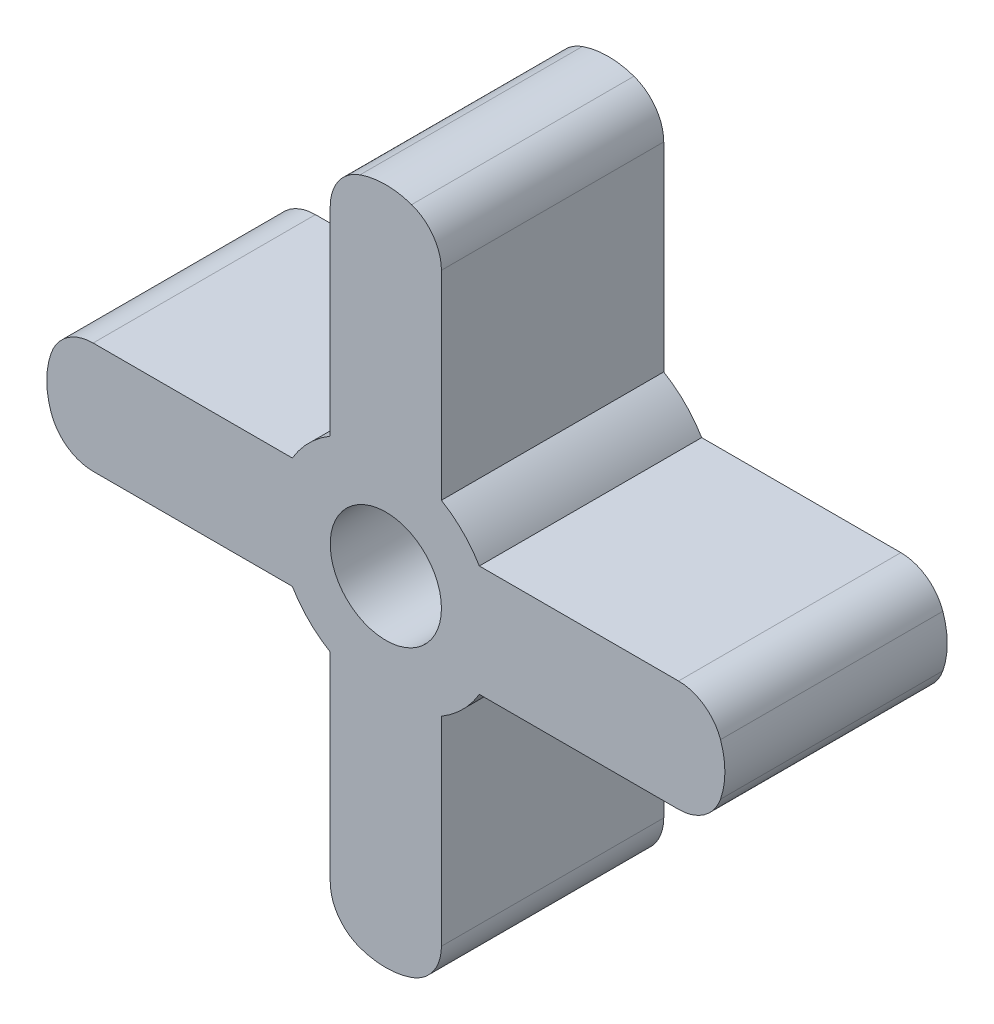
ISO-10303-21;
HEADER;
FILE_DESCRIPTION(('STEP AP214'),'2;1');
FILE_NAME('part.step','',(''),(''),'','','');
FILE_SCHEMA(('AUTOMOTIVE_DESIGN { 1 0 10303 214 1 1 1 1 }'));
ENDSEC;
DATA;
#1=APPLICATION_CONTEXT('core data for automotive mechanical design processes');
#2=APPLICATION_PROTOCOL_DEFINITION('international standard','automotive_design',2000,#1);
#3=PRODUCT_CONTEXT('',#1,'mechanical');
#4=PRODUCT('Part','Part','',(#3));
#5=PRODUCT_RELATED_PRODUCT_CATEGORY('part','',(#4));
#6=PRODUCT_DEFINITION_FORMATION('','',#4);
#7=PRODUCT_DEFINITION_CONTEXT('part definition',#1,'design');
#8=PRODUCT_DEFINITION('design','',#6,#7);
#9=PRODUCT_DEFINITION_SHAPE('','',#8);
#10=(LENGTH_UNIT() NAMED_UNIT(*) SI_UNIT(.MILLI.,.METRE.));
#11=(NAMED_UNIT(*) PLANE_ANGLE_UNIT() SI_UNIT($,.RADIAN.));
#12=(NAMED_UNIT(*) SI_UNIT($,.STERADIAN.) SOLID_ANGLE_UNIT());
#13=UNCERTAINTY_MEASURE_WITH_UNIT(LENGTH_MEASURE(1.E-05),#10,'distance_accuracy_value','');
#14=(GEOMETRIC_REPRESENTATION_CONTEXT(3) GLOBAL_UNCERTAINTY_ASSIGNED_CONTEXT((#13)) GLOBAL_UNIT_ASSIGNED_CONTEXT((#10,
#11,#12)) REPRESENTATION_CONTEXT('',''));
#15=CARTESIAN_POINT('',(0.,0.,0.));
#16=DIRECTION('',(0.,0.,1.));
#17=DIRECTION('',(1.,0.,0.));
#18=AXIS2_PLACEMENT_3D('',#15,#16,#17);
#19=CARTESIAN_POINT('',(0.,0.,10.));
#20=DIRECTION('',(0.,0.,-1.));
#21=DIRECTION('',(-1.,0.,0.));
#22=AXIS2_PLACEMENT_3D('',#19,#20,#21);
#23=CYLINDRICAL_SURFACE('',#22,4.89273251846333);
#24=CARTESIAN_POINT('',(0.,0.,0.));
#25=DIRECTION('',(0.,0.,1.));
#26=DIRECTION('',(1.,0.,0.));
#27=AXIS2_PLACEMENT_3D('',#24,#25,#26);
#28=CIRCLE('',#27,4.89273251846333);
#29=CARTESIAN_POINT('',(-2.5,4.20580925592549,0.));
#30=VERTEX_POINT('',#29);
#31=CARTESIAN_POINT('',(-4.20580925592549,2.5,0.));
#32=VERTEX_POINT('',#31);
#33=EDGE_CURVE('E227',#30,#32,#28,.T.);
#34=ORIENTED_EDGE('',*,*,#33,.T.);
#35=DIRECTION('',(0.,0.,-1.));
#36=VECTOR('',#35,1.);
#37=CARTESIAN_POINT('',(-4.20580925592549,2.5,10.));
#38=LINE('',#37,#36);
#39=CARTESIAN_POINT('',(-4.20580925592549,2.5,10.));
#40=VERTEX_POINT('',#39);
#41=EDGE_CURVE('E208',#40,#32,#38,.T.);
#42=ORIENTED_EDGE('',*,*,#41,.F.);
#43=CARTESIAN_POINT('',(0.,0.,10.));
#44=DIRECTION('',(0.,0.,1.));
#45=DIRECTION('',(1.,0.,0.));
#46=AXIS2_PLACEMENT_3D('',#43,#44,#45);
#47=CIRCLE('',#46,4.89273251846333);
#48=CARTESIAN_POINT('',(-2.5,4.20580925592549,10.));
#49=VERTEX_POINT('',#48);
#50=EDGE_CURVE('E212',#49,#40,#47,.T.);
#51=ORIENTED_EDGE('',*,*,#50,.F.);
#52=DIRECTION('',(0.,0.,-1.));
#53=VECTOR('',#52,1.);
#54=CARTESIAN_POINT('',(-2.5,4.20580925592549,10.));
#55=LINE('',#54,#53);
#56=EDGE_CURVE('E329',#49,#30,#55,.T.);
#57=ORIENTED_EDGE('',*,*,#56,.T.);
#58=EDGE_LOOP('',(#34,#42,#51,#57));
#59=FACE_BOUND('',#58,.T.);
#60=ADVANCED_FACE('F39',(#59),#23,.T.);
#61=CARTESIAN_POINT('',(-4.20580925592549,2.5,10.));
#62=DIRECTION('',(0.,-1.,0.));
#63=DIRECTION('',(1.,0.,0.));
#64=AXIS2_PLACEMENT_3D('',#61,#62,#63);
#65=PLANE('',#64);
#66=DIRECTION('',(-1.,0.,0.));
#67=VECTOR('',#66,1.);
#68=CARTESIAN_POINT('',(-4.20580925592549,2.5,0.));
#69=LINE('',#68,#67);
#70=CARTESIAN_POINT('',(-13.1651043475233,2.5,0.));
#71=VERTEX_POINT('',#70);
#72=EDGE_CURVE('E406',#32,#71,#69,.T.);
#73=ORIENTED_EDGE('',*,*,#72,.T.);
#74=DIRECTION('',(0.,0.,-1.));
#75=VECTOR('',#74,1.);
#76=CARTESIAN_POINT('',(-13.1651043475233,2.5,10.));
#77=LINE('',#76,#75);
#78=CARTESIAN_POINT('',(-13.1651043475233,2.5,10.));
#79=VERTEX_POINT('',#78);
#80=EDGE_CURVE('E211',#71,#79,#77,.F.);
#81=ORIENTED_EDGE('',*,*,#80,.T.);
#82=DIRECTION('',(-1.,0.,0.));
#83=VECTOR('',#82,1.);
#84=CARTESIAN_POINT('',(-4.20580925592549,2.5,10.));
#85=LINE('',#84,#83);
#86=EDGE_CURVE('E201',#40,#79,#85,.T.);
#87=ORIENTED_EDGE('',*,*,#86,.F.);
#88=ORIENTED_EDGE('',*,*,#41,.T.);
#89=EDGE_LOOP('',(#73,#81,#87,#88));
#90=FACE_BOUND('',#89,.T.);
#91=ADVANCED_FACE('F206',(#90),#65,.F.);
#92=CARTESIAN_POINT('',(-11.7351563990271,0.,10.));
#93=DIRECTION('',(0.,0.,-1.));
#94=DIRECTION('',(-1.,0.,0.));
#95=AXIS2_PLACEMENT_3D('',#92,#93,#94);
#96=CYLINDRICAL_SURFACE('',#95,3.51484360097292);
#97=CARTESIAN_POINT('',(-11.7351563990271,0.,0.));
#98=DIRECTION('',(0.,0.,1.));
#99=DIRECTION('',(-1.,0.,0.));
#100=AXIS2_PLACEMENT_3D('',#97,#98,#99);
#101=CIRCLE('',#100,3.51484360097292);
#102=CARTESIAN_POINT('',(-15.053019307956,1.16013415467956,0.));
#103=VERTEX_POINT('',#102);
#104=CARTESIAN_POINT('',(-15.053019307956,-1.16013415467957,0.));
#105=VERTEX_POINT('',#104);
#106=EDGE_CURVE('E415',#103,#105,#101,.T.);
#107=ORIENTED_EDGE('',*,*,#106,.T.);
#108=DIRECTION('',(0.,0.,-1.));
#109=VECTOR('',#108,1.);
#110=CARTESIAN_POINT('',(-15.053019307956,-1.16013415467957,10.));
#111=LINE('',#110,#109);
#112=CARTESIAN_POINT('',(-15.053019307956,-1.16013415467957,10.));
#113=VERTEX_POINT('',#112);
#114=EDGE_CURVE('E292',#105,#113,#111,.F.);
#115=ORIENTED_EDGE('',*,*,#114,.T.);
#116=CARTESIAN_POINT('',(-11.7351563990271,0.,10.));
#117=DIRECTION('',(0.,0.,1.));
#118=DIRECTION('',(-1.,0.,0.));
#119=AXIS2_PLACEMENT_3D('',#116,#117,#118);
#120=CIRCLE('',#119,3.51484360097292);
#121=CARTESIAN_POINT('',(-15.053019307956,1.16013415467956,10.));
#122=VERTEX_POINT('',#121);
#123=EDGE_CURVE('E213',#122,#113,#120,.T.);
#124=ORIENTED_EDGE('',*,*,#123,.F.);
#125=DIRECTION('',(0.,0.,-1.));
#126=VECTOR('',#125,1.);
#127=CARTESIAN_POINT('',(-15.053019307956,1.16013415467956,10.));
#128=LINE('',#127,#126);
#129=EDGE_CURVE('E288',#122,#103,#128,.T.);
#130=ORIENTED_EDGE('',*,*,#129,.T.);
#131=EDGE_LOOP('',(#107,#115,#124,#130));
#132=FACE_BOUND('',#131,.T.);
#133=ADVANCED_FACE('F480',(#132),#96,.T.);
#134=CARTESIAN_POINT('',(-4.20580925592549,-2.5,10.));
#135=DIRECTION('',(0.,1.,0.));
#136=DIRECTION('',(-1.,0.,0.));
#137=AXIS2_PLACEMENT_3D('',#134,#135,#136);
#138=PLANE('',#137);
#139=DIRECTION('',(1.,0.,0.));
#140=VECTOR('',#139,1.);
#141=CARTESIAN_POINT('',(-4.20580925592549,-2.5,10.));
#142=LINE('',#141,#140);
#143=CARTESIAN_POINT('',(-13.1651043475233,-2.5,10.));
#144=VERTEX_POINT('',#143);
#145=CARTESIAN_POINT('',(-4.20580925592549,-2.5,10.));
#146=VERTEX_POINT('',#145);
#147=EDGE_CURVE('E423',#144,#146,#142,.T.);
#148=ORIENTED_EDGE('',*,*,#147,.F.);
#149=DIRECTION('',(0.,0.,-1.));
#150=VECTOR('',#149,1.);
#151=CARTESIAN_POINT('',(-13.1651043475233,-2.5,10.));
#152=LINE('',#151,#150);
#153=CARTESIAN_POINT('',(-13.1651043475233,-2.5,0.));
#154=VERTEX_POINT('',#153);
#155=EDGE_CURVE('E281',#144,#154,#152,.T.);
#156=ORIENTED_EDGE('',*,*,#155,.T.);
#157=DIRECTION('',(1.,0.,0.));
#158=VECTOR('',#157,1.);
#159=CARTESIAN_POINT('',(-4.20580925592549,-2.5,0.));
#160=LINE('',#159,#158);
#161=CARTESIAN_POINT('',(-4.20580925592549,-2.5,0.));
#162=VERTEX_POINT('',#161);
#163=EDGE_CURVE('E365',#154,#162,#160,.T.);
#164=ORIENTED_EDGE('',*,*,#163,.T.);
#165=DIRECTION('',(0.,0.,-1.));
#166=VECTOR('',#165,1.);
#167=CARTESIAN_POINT('',(-4.20580925592549,-2.5,10.));
#168=LINE('',#167,#166);
#169=EDGE_CURVE('E228',#146,#162,#168,.T.);
#170=ORIENTED_EDGE('',*,*,#169,.F.);
#171=EDGE_LOOP('',(#148,#156,#164,#170));
#172=FACE_BOUND('',#171,.T.);
#173=ADVANCED_FACE('F417',(#172),#138,.F.);
#174=CARTESIAN_POINT('',(0.,0.,10.));
#175=DIRECTION('',(0.,0.,-1.));
#176=DIRECTION('',(-1.,0.,0.));
#177=AXIS2_PLACEMENT_3D('',#174,#175,#176);
#178=CYLINDRICAL_SURFACE('',#177,4.89273251846333);
#179=CARTESIAN_POINT('',(0.,0.,0.));
#180=DIRECTION('',(0.,0.,1.));
#181=DIRECTION('',(1.,0.,0.));
#182=AXIS2_PLACEMENT_3D('',#179,#180,#181);
#183=CIRCLE('',#182,4.89273251846333);
#184=CARTESIAN_POINT('',(-2.5,-4.20580925592549,0.));
#185=VERTEX_POINT('',#184);
#186=EDGE_CURVE('E360',#162,#185,#183,.T.);
#187=ORIENTED_EDGE('',*,*,#186,.T.);
#188=DIRECTION('',(0.,0.,-1.));
#189=VECTOR('',#188,1.);
#190=CARTESIAN_POINT('',(-2.5,-4.20580925592549,10.));
#191=LINE('',#190,#189);
#192=CARTESIAN_POINT('',(-2.5,-4.20580925592549,10.));
#193=VERTEX_POINT('',#192);
#194=EDGE_CURVE('E232',#193,#185,#191,.T.);
#195=ORIENTED_EDGE('',*,*,#194,.F.);
#196=CARTESIAN_POINT('',(0.,0.,10.));
#197=DIRECTION('',(0.,0.,1.));
#198=DIRECTION('',(1.,0.,0.));
#199=AXIS2_PLACEMENT_3D('',#196,#197,#198);
#200=CIRCLE('',#199,4.89273251846333);
#201=EDGE_CURVE('E419',#146,#193,#200,.T.);
#202=ORIENTED_EDGE('',*,*,#201,.F.);
#203=ORIENTED_EDGE('',*,*,#169,.T.);
#204=EDGE_LOOP('',(#187,#195,#202,#203));
#205=FACE_BOUND('',#204,.T.);
#206=ADVANCED_FACE('F420',(#205),#178,.T.);
#207=CARTESIAN_POINT('',(-2.5,-4.20580925592549,10.));
#208=DIRECTION('',(1.,0.,0.));
#209=DIRECTION('',(0.,0.,-1.));
#210=AXIS2_PLACEMENT_3D('',#207,#208,#209);
#211=PLANE('',#210);
#212=DIRECTION('',(0.,-1.,0.));
#213=VECTOR('',#212,1.);
#214=CARTESIAN_POINT('',(-2.5,-4.20580925592549,0.));
#215=LINE('',#214,#213);
#216=CARTESIAN_POINT('',(-2.5,-13.1651043475233,0.));
#217=VERTEX_POINT('',#216);
#218=EDGE_CURVE('E349',#185,#217,#215,.T.);
#219=ORIENTED_EDGE('',*,*,#218,.T.);
#220=DIRECTION('',(0.,0.,-1.));
#221=VECTOR('',#220,1.);
#222=CARTESIAN_POINT('',(-2.5,-13.1651043475233,10.));
#223=LINE('',#222,#221);
#224=CARTESIAN_POINT('',(-2.5,-13.1651043475233,10.));
#225=VERTEX_POINT('',#224);
#226=EDGE_CURVE('E283',#217,#225,#223,.F.);
#227=ORIENTED_EDGE('',*,*,#226,.T.);
#228=DIRECTION('',(0.,-1.,0.));
#229=VECTOR('',#228,1.);
#230=CARTESIAN_POINT('',(-2.5,-4.20580925592549,10.));
#231=LINE('',#230,#229);
#232=EDGE_CURVE('E355',#193,#225,#231,.T.);
#233=ORIENTED_EDGE('',*,*,#232,.F.);
#234=ORIENTED_EDGE('',*,*,#194,.T.);
#235=EDGE_LOOP('',(#219,#227,#233,#234));
#236=FACE_BOUND('',#235,.T.);
#237=ADVANCED_FACE('F346',(#236),#211,.F.);
#238=CARTESIAN_POINT('',(0.,-11.7351563990271,10.));
#239=DIRECTION('',(0.,0.,-1.));
#240=DIRECTION('',(-1.,0.,0.));
#241=AXIS2_PLACEMENT_3D('',#238,#239,#240);
#242=CYLINDRICAL_SURFACE('',#241,3.51484360097292);
#243=CARTESIAN_POINT('',(0.,-11.7351563990271,0.));
#244=DIRECTION('',(0.,0.,1.));
#245=DIRECTION('',(-1.,0.,0.));
#246=AXIS2_PLACEMENT_3D('',#243,#244,#245);
#247=CIRCLE('',#246,3.51484360097292);
#248=CARTESIAN_POINT('',(-1.16013415467956,-15.053019307956,0.));
#249=VERTEX_POINT('',#248);
#250=CARTESIAN_POINT('',(1.16013415467957,-15.053019307956,0.));
#251=VERTEX_POINT('',#250);
#252=EDGE_CURVE('E357',#249,#251,#247,.T.);
#253=ORIENTED_EDGE('',*,*,#252,.T.);
#254=DIRECTION('',(0.,0.,-1.));
#255=VECTOR('',#254,1.);
#256=CARTESIAN_POINT('',(1.16013415467957,-15.053019307956,10.));
#257=LINE('',#256,#255);
#258=CARTESIAN_POINT('',(1.16013415467957,-15.053019307956,10.));
#259=VERTEX_POINT('',#258);
#260=EDGE_CURVE('E282',#251,#259,#257,.F.);
#261=ORIENTED_EDGE('',*,*,#260,.T.);
#262=CARTESIAN_POINT('',(0.,-11.7351563990271,10.));
#263=DIRECTION('',(0.,0.,1.));
#264=DIRECTION('',(-1.,0.,0.));
#265=AXIS2_PLACEMENT_3D('',#262,#263,#264);
#266=CIRCLE('',#265,3.51484360097292);
#267=CARTESIAN_POINT('',(-1.16013415467956,-15.053019307956,10.));
#268=VERTEX_POINT('',#267);
#269=EDGE_CURVE('E421',#268,#259,#266,.T.);
#270=ORIENTED_EDGE('',*,*,#269,.F.);
#271=DIRECTION('',(0.,0.,-1.));
#272=VECTOR('',#271,1.);
#273=CARTESIAN_POINT('',(-1.16013415467956,-15.053019307956,10.));
#274=LINE('',#273,#272);
#275=EDGE_CURVE('E279',#268,#249,#274,.T.);
#276=ORIENTED_EDGE('',*,*,#275,.T.);
#277=EDGE_LOOP('',(#253,#261,#270,#276));
#278=FACE_BOUND('',#277,.T.);
#279=ADVANCED_FACE('F454',(#278),#242,.T.);
#280=CARTESIAN_POINT('',(2.5,-4.20580925592549,10.));
#281=DIRECTION('',(-1.,0.,0.));
#282=DIRECTION('',(0.,-1.,0.));
#283=AXIS2_PLACEMENT_3D('',#280,#281,#282);
#284=PLANE('',#283);
#285=DIRECTION('',(0.,1.,0.));
#286=VECTOR('',#285,1.);
#287=CARTESIAN_POINT('',(2.5,-4.20580925592549,10.));
#288=LINE('',#287,#286);
#289=CARTESIAN_POINT('',(2.5,-13.1651043475233,10.));
#290=VERTEX_POINT('',#289);
#291=CARTESIAN_POINT('',(2.5,-4.20580925592549,10.));
#292=VERTEX_POINT('',#291);
#293=EDGE_CURVE('E429',#290,#292,#288,.T.);
#294=ORIENTED_EDGE('',*,*,#293,.F.);
#295=DIRECTION('',(0.,0.,-1.));
#296=VECTOR('',#295,1.);
#297=CARTESIAN_POINT('',(2.5,-13.1651043475233,10.));
#298=LINE('',#297,#296);
#299=CARTESIAN_POINT('',(2.5,-13.1651043475233,0.));
#300=VERTEX_POINT('',#299);
#301=EDGE_CURVE('E274',#290,#300,#298,.T.);
#302=ORIENTED_EDGE('',*,*,#301,.T.);
#303=DIRECTION('',(0.,1.,0.));
#304=VECTOR('',#303,1.);
#305=CARTESIAN_POINT('',(2.5,-4.20580925592549,0.));
#306=LINE('',#305,#304);
#307=CARTESIAN_POINT('',(2.5,-4.20580925592549,0.));
#308=VERTEX_POINT('',#307);
#309=EDGE_CURVE('E362',#300,#308,#306,.T.);
#310=ORIENTED_EDGE('',*,*,#309,.T.);
#311=DIRECTION('',(0.,0.,-1.));
#312=VECTOR('',#311,1.);
#313=CARTESIAN_POINT('',(2.5,-4.20580925592549,10.));
#314=LINE('',#313,#312);
#315=EDGE_CURVE('E336',#292,#308,#314,.T.);
#316=ORIENTED_EDGE('',*,*,#315,.F.);
#317=EDGE_LOOP('',(#294,#302,#310,#316));
#318=FACE_BOUND('',#317,.T.);
#319=ADVANCED_FACE('F450',(#318),#284,.F.);
#320=CARTESIAN_POINT('',(0.,0.,10.));
#321=DIRECTION('',(0.,0.,-1.));
#322=DIRECTION('',(-1.,0.,0.));
#323=AXIS2_PLACEMENT_3D('',#320,#321,#322);
#324=CYLINDRICAL_SURFACE('',#323,4.89273251846333);
#325=CARTESIAN_POINT('',(0.,0.,0.));
#326=DIRECTION('',(0.,0.,1.));
#327=DIRECTION('',(1.,0.,0.));
#328=AXIS2_PLACEMENT_3D('',#325,#326,#327);
#329=CIRCLE('',#328,4.89273251846333);
#330=CARTESIAN_POINT('',(4.20580925592549,-2.5,0.));
#331=VERTEX_POINT('',#330);
#332=EDGE_CURVE('E369',#308,#331,#329,.T.);
#333=ORIENTED_EDGE('',*,*,#332,.T.);
#334=DIRECTION('',(0.,0.,-1.));
#335=VECTOR('',#334,1.);
#336=CARTESIAN_POINT('',(4.20580925592549,-2.5,10.));
#337=LINE('',#336,#335);
#338=CARTESIAN_POINT('',(4.20580925592549,-2.5,10.));
#339=VERTEX_POINT('',#338);
#340=EDGE_CURVE('E340',#339,#331,#337,.T.);
#341=ORIENTED_EDGE('',*,*,#340,.F.);
#342=CARTESIAN_POINT('',(0.,0.,10.));
#343=DIRECTION('',(0.,0.,1.));
#344=DIRECTION('',(1.,0.,0.));
#345=AXIS2_PLACEMENT_3D('',#342,#343,#344);
#346=CIRCLE('',#345,4.89273251846333);
#347=EDGE_CURVE('E405',#292,#339,#346,.T.);
#348=ORIENTED_EDGE('',*,*,#347,.F.);
#349=ORIENTED_EDGE('',*,*,#315,.T.);
#350=EDGE_LOOP('',(#333,#341,#348,#349));
#351=FACE_BOUND('',#350,.T.);
#352=ADVANCED_FACE('F440',(#351),#324,.T.);
#353=CARTESIAN_POINT('',(4.20580925592549,-2.5,10.));
#354=DIRECTION('',(0.,1.,0.));
#355=DIRECTION('',(-1.,0.,0.));
#356=AXIS2_PLACEMENT_3D('',#353,#354,#355);
#357=PLANE('',#356);
#358=DIRECTION('',(1.,0.,0.));
#359=VECTOR('',#358,1.);
#360=CARTESIAN_POINT('',(4.20580925592549,-2.5,0.));
#361=LINE('',#360,#359);
#362=CARTESIAN_POINT('',(13.1651043475233,-2.5,0.));
#363=VERTEX_POINT('',#362);
#364=EDGE_CURVE('E371',#331,#363,#361,.T.);
#365=ORIENTED_EDGE('',*,*,#364,.T.);
#366=DIRECTION('',(0.,0.,-1.));
#367=VECTOR('',#366,1.);
#368=CARTESIAN_POINT('',(13.1651043475233,-2.5,10.));
#369=LINE('',#368,#367);
#370=CARTESIAN_POINT('',(13.1651043475233,-2.5,10.));
#371=VERTEX_POINT('',#370);
#372=EDGE_CURVE('E272',#363,#371,#369,.F.);
#373=ORIENTED_EDGE('',*,*,#372,.T.);
#374=DIRECTION('',(1.,0.,0.));
#375=VECTOR('',#374,1.);
#376=CARTESIAN_POINT('',(4.20580925592549,-2.5,10.));
#377=LINE('',#376,#375);
#378=EDGE_CURVE('E397',#339,#371,#377,.T.);
#379=ORIENTED_EDGE('',*,*,#378,.F.);
#380=ORIENTED_EDGE('',*,*,#340,.T.);
#381=EDGE_LOOP('',(#365,#373,#379,#380));
#382=FACE_BOUND('',#381,.T.);
#383=ADVANCED_FACE('F442',(#382),#357,.F.);
#384=CARTESIAN_POINT('',(11.7351563990271,0.,10.));
#385=DIRECTION('',(0.,0.,-1.));
#386=DIRECTION('',(-1.,0.,0.));
#387=AXIS2_PLACEMENT_3D('',#384,#385,#386);
#388=CYLINDRICAL_SURFACE('',#387,3.51484360097292);
#389=CARTESIAN_POINT('',(11.7351563990271,0.,0.));
#390=DIRECTION('',(0.,0.,1.));
#391=DIRECTION('',(-1.,0.,0.));
#392=AXIS2_PLACEMENT_3D('',#389,#390,#391);
#393=CIRCLE('',#392,3.51484360097292);
#394=CARTESIAN_POINT('',(15.053019307956,-1.16013415467956,0.));
#395=VERTEX_POINT('',#394);
#396=CARTESIAN_POINT('',(15.053019307956,1.16013415467957,0.));
#397=VERTEX_POINT('',#396);
#398=EDGE_CURVE('E372',#395,#397,#393,.T.);
#399=ORIENTED_EDGE('',*,*,#398,.T.);
#400=DIRECTION('',(0.,0.,-1.));
#401=VECTOR('',#400,1.);
#402=CARTESIAN_POINT('',(15.053019307956,1.16013415467957,10.));
#403=LINE('',#402,#401);
#404=CARTESIAN_POINT('',(15.053019307956,1.16013415467957,10.));
#405=VERTEX_POINT('',#404);
#406=EDGE_CURVE('E258',#397,#405,#403,.F.);
#407=ORIENTED_EDGE('',*,*,#406,.T.);
#408=CARTESIAN_POINT('',(11.7351563990271,0.,10.));
#409=DIRECTION('',(0.,0.,1.));
#410=DIRECTION('',(-1.,0.,0.));
#411=AXIS2_PLACEMENT_3D('',#408,#409,#410);
#412=CIRCLE('',#411,3.51484360097292);
#413=CARTESIAN_POINT('',(15.053019307956,-1.16013415467956,10.));
#414=VERTEX_POINT('',#413);
#415=EDGE_CURVE('E391',#414,#405,#412,.T.);
#416=ORIENTED_EDGE('',*,*,#415,.F.);
#417=DIRECTION('',(0.,0.,-1.));
#418=VECTOR('',#417,1.);
#419=CARTESIAN_POINT('',(15.053019307956,-1.16013415467956,10.));
#420=LINE('',#419,#418);
#421=EDGE_CURVE('E251',#414,#395,#420,.T.);
#422=ORIENTED_EDGE('',*,*,#421,.T.);
#423=EDGE_LOOP('',(#399,#407,#416,#422));
#424=FACE_BOUND('',#423,.T.);
#425=ADVANCED_FACE('F394',(#424),#388,.T.);
#426=CARTESIAN_POINT('',(4.20580925592549,2.5,10.));
#427=DIRECTION('',(0.,-1.,0.));
#428=DIRECTION('',(1.,0.,0.));
#429=AXIS2_PLACEMENT_3D('',#426,#427,#428);
#430=PLANE('',#429);
#431=DIRECTION('',(-1.,0.,0.));
#432=VECTOR('',#431,1.);
#433=CARTESIAN_POINT('',(4.20580925592549,2.5,10.));
#434=LINE('',#433,#432);
#435=CARTESIAN_POINT('',(13.1651043475233,2.5,10.));
#436=VERTEX_POINT('',#435);
#437=CARTESIAN_POINT('',(4.20580925592549,2.5,10.));
#438=VERTEX_POINT('',#437);
#439=EDGE_CURVE('E390',#436,#438,#434,.T.);
#440=ORIENTED_EDGE('',*,*,#439,.F.);
#441=DIRECTION('',(0.,0.,-1.));
#442=VECTOR('',#441,1.);
#443=CARTESIAN_POINT('',(13.1651043475233,2.5,10.));
#444=LINE('',#443,#442);
#445=CARTESIAN_POINT('',(13.1651043475233,2.5,0.));
#446=VERTEX_POINT('',#445);
#447=EDGE_CURVE('E230',#436,#446,#444,.T.);
#448=ORIENTED_EDGE('',*,*,#447,.T.);
#449=DIRECTION('',(-1.,0.,0.));
#450=VECTOR('',#449,1.);
#451=CARTESIAN_POINT('',(4.20580925592549,2.5,0.));
#452=LINE('',#451,#450);
#453=CARTESIAN_POINT('',(4.20580925592549,2.5,0.));
#454=VERTEX_POINT('',#453);
#455=EDGE_CURVE('E380',#446,#454,#452,.T.);
#456=ORIENTED_EDGE('',*,*,#455,.T.);
#457=DIRECTION('',(0.,0.,-1.));
#458=VECTOR('',#457,1.);
#459=CARTESIAN_POINT('',(4.20580925592549,2.5,10.));
#460=LINE('',#459,#458);
#461=EDGE_CURVE('E331',#438,#454,#460,.T.);
#462=ORIENTED_EDGE('',*,*,#461,.F.);
#463=EDGE_LOOP('',(#440,#448,#456,#462));
#464=FACE_BOUND('',#463,.T.);
#465=ADVANCED_FACE('F384',(#464),#430,.F.);
#466=CARTESIAN_POINT('',(0.,0.,10.));
#467=DIRECTION('',(0.,0.,-1.));
#468=DIRECTION('',(-1.,0.,0.));
#469=AXIS2_PLACEMENT_3D('',#466,#467,#468);
#470=CYLINDRICAL_SURFACE('',#469,4.89273251846333);
#471=CARTESIAN_POINT('',(0.,0.,0.));
#472=DIRECTION('',(0.,0.,1.));
#473=DIRECTION('',(1.,0.,0.));
#474=AXIS2_PLACEMENT_3D('',#471,#472,#473);
#475=CIRCLE('',#474,4.89273251846333);
#476=CARTESIAN_POINT('',(2.5,4.20580925592549,0.));
#477=VERTEX_POINT('',#476);
#478=EDGE_CURVE('E326',#454,#477,#475,.T.);
#479=ORIENTED_EDGE('',*,*,#478,.T.);
#480=DIRECTION('',(0.,0.,-1.));
#481=VECTOR('',#480,1.);
#482=CARTESIAN_POINT('',(2.5,4.20580925592549,10.));
#483=LINE('',#482,#481);
#484=CARTESIAN_POINT('',(2.5,4.20580925592549,10.));
#485=VERTEX_POINT('',#484);
#486=EDGE_CURVE('E335',#485,#477,#483,.T.);
#487=ORIENTED_EDGE('',*,*,#486,.F.);
#488=CARTESIAN_POINT('',(0.,0.,10.));
#489=DIRECTION('',(0.,0.,1.));
#490=DIRECTION('',(1.,0.,0.));
#491=AXIS2_PLACEMENT_3D('',#488,#489,#490);
#492=CIRCLE('',#491,4.89273251846333);
#493=EDGE_CURVE('E313',#438,#485,#492,.T.);
#494=ORIENTED_EDGE('',*,*,#493,.F.);
#495=ORIENTED_EDGE('',*,*,#461,.T.);
#496=EDGE_LOOP('',(#479,#487,#494,#495));
#497=FACE_BOUND('',#496,.T.);
#498=ADVANCED_FACE('F379',(#497),#470,.T.);
#499=CARTESIAN_POINT('',(2.5,4.20580925592549,10.));
#500=DIRECTION('',(-1.,0.,0.));
#501=DIRECTION('',(0.,-1.,0.));
#502=AXIS2_PLACEMENT_3D('',#499,#500,#501);
#503=PLANE('',#502);
#504=DIRECTION('',(0.,1.,0.));
#505=VECTOR('',#504,1.);
#506=CARTESIAN_POINT('',(2.5,4.20580925592549,0.));
#507=LINE('',#506,#505);
#508=CARTESIAN_POINT('',(2.5,13.1651043475233,0.));
#509=VERTEX_POINT('',#508);
#510=EDGE_CURVE('E307',#477,#509,#507,.T.);
#511=ORIENTED_EDGE('',*,*,#510,.T.);
#512=DIRECTION('',(0.,0.,-1.));
#513=VECTOR('',#512,1.);
#514=CARTESIAN_POINT('',(2.5,13.1651043475233,10.));
#515=LINE('',#514,#513);
#516=CARTESIAN_POINT('',(2.5,13.1651043475233,10.));
#517=VERTEX_POINT('',#516);
#518=EDGE_CURVE('E48',#509,#517,#515,.F.);
#519=ORIENTED_EDGE('',*,*,#518,.T.);
#520=DIRECTION('',(0.,1.,0.));
#521=VECTOR('',#520,1.);
#522=CARTESIAN_POINT('',(2.5,4.20580925592549,10.));
#523=LINE('',#522,#521);
#524=EDGE_CURVE('E304',#485,#517,#523,.T.);
#525=ORIENTED_EDGE('',*,*,#524,.F.);
#526=ORIENTED_EDGE('',*,*,#486,.T.);
#527=EDGE_LOOP('',(#511,#519,#525,#526));
#528=FACE_BOUND('',#527,.T.);
#529=ADVANCED_FACE('F303',(#528),#503,.F.);
#530=CARTESIAN_POINT('',(0.,11.7351563990271,10.));
#531=DIRECTION('',(0.,0.,-1.));
#532=DIRECTION('',(-1.,0.,0.));
#533=AXIS2_PLACEMENT_3D('',#530,#531,#532);
#534=CYLINDRICAL_SURFACE('',#533,3.51484360097292);
#535=CARTESIAN_POINT('',(0.,11.7351563990271,10.));
#536=DIRECTION('',(0.,0.,1.));
#537=DIRECTION('',(-1.,0.,0.));
#538=AXIS2_PLACEMENT_3D('',#535,#536,#537);
#539=CIRCLE('',#538,3.51484360097292);
#540=CARTESIAN_POINT('',(1.16013415467956,15.053019307956,10.));
#541=VERTEX_POINT('',#540);
#542=CARTESIAN_POINT('',(-1.16013415467957,15.053019307956,10.));
#543=VERTEX_POINT('',#542);
#544=EDGE_CURVE('E311',#541,#543,#539,.T.);
#545=ORIENTED_EDGE('',*,*,#544,.F.);
#546=DIRECTION('',(0.,0.,-1.));
#547=VECTOR('',#546,1.);
#548=CARTESIAN_POINT('',(1.16013415467957,15.053019307956,10.));
#549=LINE('',#548,#547);
#550=CARTESIAN_POINT('',(1.16013415467956,15.053019307956,0.));
#551=VERTEX_POINT('',#550);
#552=EDGE_CURVE('E293',#541,#551,#549,.T.);
#553=ORIENTED_EDGE('',*,*,#552,.T.);
#554=CARTESIAN_POINT('',(0.,11.7351563990271,0.));
#555=DIRECTION('',(0.,0.,1.));
#556=DIRECTION('',(-1.,0.,0.));
#557=AXIS2_PLACEMENT_3D('',#554,#555,#556);
#558=CIRCLE('',#557,3.51484360097292);
#559=CARTESIAN_POINT('',(-1.16013415467957,15.053019307956,0.));
#560=VERTEX_POINT('',#559);
#561=EDGE_CURVE('E317',#551,#560,#558,.T.);
#562=ORIENTED_EDGE('',*,*,#561,.T.);
#563=DIRECTION('',(0.,0.,-1.));
#564=VECTOR('',#563,1.);
#565=CARTESIAN_POINT('',(-1.16013415467957,15.053019307956,10.));
#566=LINE('',#565,#564);
#567=EDGE_CURVE('E63',#560,#543,#566,.F.);
#568=ORIENTED_EDGE('',*,*,#567,.T.);
#569=EDGE_LOOP('',(#545,#553,#562,#568));
#570=FACE_BOUND('',#569,.T.);
#571=ADVANCED_FACE('F318',(#570),#534,.T.);
#572=CARTESIAN_POINT('',(-2.5,4.20580925592549,10.));
#573=DIRECTION('',(1.,0.,0.));
#574=DIRECTION('',(0.,1.,0.));
#575=AXIS2_PLACEMENT_3D('',#572,#573,#574);
#576=PLANE('',#575);
#577=DIRECTION('',(0.,-1.,0.));
#578=VECTOR('',#577,1.);
#579=CARTESIAN_POINT('',(-2.5,4.20580925592549,10.));
#580=LINE('',#579,#578);
#581=CARTESIAN_POINT('',(-2.5,13.1651043475233,10.));
#582=VERTEX_POINT('',#581);
#583=EDGE_CURVE('E218',#582,#49,#580,.T.);
#584=ORIENTED_EDGE('',*,*,#583,.F.);
#585=DIRECTION('',(0.,0.,-1.));
#586=VECTOR('',#585,1.);
#587=CARTESIAN_POINT('',(-2.5,13.1651043475233,10.));
#588=LINE('',#587,#586);
#589=CARTESIAN_POINT('',(-2.5,13.1651043475233,0.));
#590=VERTEX_POINT('',#589);
#591=EDGE_CURVE('E11',#582,#590,#588,.T.);
#592=ORIENTED_EDGE('',*,*,#591,.T.);
#593=DIRECTION('',(0.,-1.,0.));
#594=VECTOR('',#593,1.);
#595=CARTESIAN_POINT('',(-2.5,4.20580925592549,0.));
#596=LINE('',#595,#594);
#597=EDGE_CURVE('E224',#590,#30,#596,.T.);
#598=ORIENTED_EDGE('',*,*,#597,.T.);
#599=ORIENTED_EDGE('',*,*,#56,.F.);
#600=EDGE_LOOP('',(#584,#592,#598,#599));
#601=FACE_BOUND('',#600,.T.);
#602=ADVANCED_FACE('F554',(#601),#576,.F.);
#603=CARTESIAN_POINT('',(0.,0.,10.));
#604=DIRECTION('',(0.,0.,1.));
#605=DIRECTION('',(1.,0.,0.));
#606=AXIS2_PLACEMENT_3D('',#603,#604,#605);
#607=PLANE('',#606);
#608=CARTESIAN_POINT('',(0.,0.,10.));
#609=DIRECTION('',(0.,0.,1.));
#610=DIRECTION('',(1.,0.,0.));
#611=AXIS2_PLACEMENT_3D('',#608,#609,#610);
#612=CIRCLE('',#611,2.5);
#613=CARTESIAN_POINT('',(2.5,0.,10.));
#614=VERTEX_POINT('',#613);
#615=EDGE_CURVE('E688',#614,#614,#612,.T.);
#616=ORIENTED_EDGE('',*,*,#615,.F.);
#617=EDGE_LOOP('',(#616));
#618=FACE_BOUND('',#617,.T.);
#619=ORIENTED_EDGE('',*,*,#415,.T.);
#620=CARTESIAN_POINT('',(13.1651043475233,0.500000000000003,10.));
#621=DIRECTION('',(0.,0.,1.));
#622=DIRECTION('',(1.,0.,0.));
#623=AXIS2_PLACEMENT_3D('',#620,#621,#622);
#624=CIRCLE('',#623,2.);
#625=EDGE_CURVE('E271',#405,#436,#624,.T.);
#626=ORIENTED_EDGE('',*,*,#625,.T.);
#627=ORIENTED_EDGE('',*,*,#439,.T.);
#628=ORIENTED_EDGE('',*,*,#493,.T.);
#629=ORIENTED_EDGE('',*,*,#524,.T.);
#630=CARTESIAN_POINT('',(0.500000000000003,13.1651043475233,10.));
#631=DIRECTION('',(0.,0.,1.));
#632=DIRECTION('',(1.,0.,0.));
#633=AXIS2_PLACEMENT_3D('',#630,#631,#632);
#634=CIRCLE('',#633,2.);
#635=EDGE_CURVE('E259',#517,#541,#634,.T.);
#636=ORIENTED_EDGE('',*,*,#635,.T.);
#637=ORIENTED_EDGE('',*,*,#544,.T.);
#638=CARTESIAN_POINT('',(-0.500000000000003,13.1651043475233,10.));
#639=DIRECTION('',(0.,0.,1.));
#640=DIRECTION('',(1.,0.,0.));
#641=AXIS2_PLACEMENT_3D('',#638,#639,#640);
#642=CIRCLE('',#641,2.);
#643=EDGE_CURVE('E54',#543,#582,#642,.T.);
#644=ORIENTED_EDGE('',*,*,#643,.T.);
#645=ORIENTED_EDGE('',*,*,#583,.T.);
#646=ORIENTED_EDGE('',*,*,#50,.T.);
#647=ORIENTED_EDGE('',*,*,#86,.T.);
#648=CARTESIAN_POINT('',(-13.1651043475233,0.5,10.));
#649=DIRECTION('',(0.,0.,1.));
#650=DIRECTION('',(1.,0.,0.));
#651=AXIS2_PLACEMENT_3D('',#648,#649,#650);
#652=CIRCLE('',#651,2.);
#653=EDGE_CURVE('E261',#79,#122,#652,.T.);
#654=ORIENTED_EDGE('',*,*,#653,.T.);
#655=ORIENTED_EDGE('',*,*,#123,.T.);
#656=CARTESIAN_POINT('',(-13.1651043475233,-0.500000000000005,10.));
#657=DIRECTION('',(0.,0.,1.));
#658=DIRECTION('',(1.,0.,0.));
#659=AXIS2_PLACEMENT_3D('',#656,#657,#658);
#660=CIRCLE('',#659,2.);
#661=EDGE_CURVE('E263',#113,#144,#660,.T.);
#662=ORIENTED_EDGE('',*,*,#661,.T.);
#663=ORIENTED_EDGE('',*,*,#147,.T.);
#664=ORIENTED_EDGE('',*,*,#201,.T.);
#665=ORIENTED_EDGE('',*,*,#232,.T.);
#666=CARTESIAN_POINT('',(-0.500000000000001,-13.1651043475233,10.));
#667=DIRECTION('',(0.,0.,1.));
#668=DIRECTION('',(1.,0.,0.));
#669=AXIS2_PLACEMENT_3D('',#666,#667,#668);
#670=CIRCLE('',#669,2.);
#671=EDGE_CURVE('E264',#225,#268,#670,.T.);
#672=ORIENTED_EDGE('',*,*,#671,.T.);
#673=ORIENTED_EDGE('',*,*,#269,.T.);
#674=CARTESIAN_POINT('',(0.500000000000004,-13.1651043475233,10.));
#675=DIRECTION('',(0.,0.,1.));
#676=DIRECTION('',(1.,0.,0.));
#677=AXIS2_PLACEMENT_3D('',#674,#675,#676);
#678=CIRCLE('',#677,2.);
#679=EDGE_CURVE('E270',#259,#290,#678,.T.);
#680=ORIENTED_EDGE('',*,*,#679,.T.);
#681=ORIENTED_EDGE('',*,*,#293,.T.);
#682=ORIENTED_EDGE('',*,*,#347,.T.);
#683=ORIENTED_EDGE('',*,*,#378,.T.);
#684=CARTESIAN_POINT('',(13.1651043475233,-0.500000000000002,10.));
#685=DIRECTION('',(0.,0.,1.));
#686=DIRECTION('',(1.,0.,0.));
#687=AXIS2_PLACEMENT_3D('',#684,#685,#686);
#688=CIRCLE('',#687,2.);
#689=EDGE_CURVE('E267',#371,#414,#688,.T.);
#690=ORIENTED_EDGE('',*,*,#689,.T.);
#691=EDGE_LOOP('',(#619,#626,#627,#628,#629,#636,#637,#644,#645,#646,#647,#654,#655,#662,#663,
#664,#665,#672,#673,#680,#681,#682,#683,#690));
#692=FACE_BOUND('',#691,.T.);
#693=ADVANCED_FACE('F217',(#618,#692),#607,.T.);
#694=CARTESIAN_POINT('',(0.,0.,0.));
#695=DIRECTION('',(0.,0.,1.));
#696=DIRECTION('',(1.,0.,0.));
#697=AXIS2_PLACEMENT_3D('',#694,#695,#696);
#698=PLANE('',#697);
#699=CARTESIAN_POINT('',(0.,0.,0.));
#700=DIRECTION('',(0.,0.,1.));
#701=DIRECTION('',(1.,0.,0.));
#702=AXIS2_PLACEMENT_3D('',#699,#700,#701);
#703=CIRCLE('',#702,2.5);
#704=CARTESIAN_POINT('',(2.5,0.,0.));
#705=VERTEX_POINT('',#704);
#706=EDGE_CURVE('E43',#705,#705,#703,.F.);
#707=ORIENTED_EDGE('',*,*,#706,.F.);
#708=EDGE_LOOP('',(#707));
#709=FACE_BOUND('',#708,.T.);
#710=ORIENTED_EDGE('',*,*,#455,.F.);
#711=CARTESIAN_POINT('',(13.1651043475233,0.500000000000003,0.));
#712=DIRECTION('',(0.,0.,1.));
#713=DIRECTION('',(1.,0.,0.));
#714=AXIS2_PLACEMENT_3D('',#711,#712,#713);
#715=CIRCLE('',#714,2.);
#716=EDGE_CURVE('E253',#446,#397,#715,.F.);
#717=ORIENTED_EDGE('',*,*,#716,.T.);
#718=ORIENTED_EDGE('',*,*,#398,.F.);
#719=CARTESIAN_POINT('',(13.1651043475233,-0.500000000000002,0.));
#720=DIRECTION('',(0.,0.,1.));
#721=DIRECTION('',(1.,0.,0.));
#722=AXIS2_PLACEMENT_3D('',#719,#720,#721);
#723=CIRCLE('',#722,2.);
#724=EDGE_CURVE('E247',#395,#363,#723,.F.);
#725=ORIENTED_EDGE('',*,*,#724,.T.);
#726=ORIENTED_EDGE('',*,*,#364,.F.);
#727=ORIENTED_EDGE('',*,*,#332,.F.);
#728=ORIENTED_EDGE('',*,*,#309,.F.);
#729=CARTESIAN_POINT('',(0.500000000000004,-13.1651043475233,0.));
#730=DIRECTION('',(0.,0.,1.));
#731=DIRECTION('',(1.,0.,0.));
#732=AXIS2_PLACEMENT_3D('',#729,#730,#731);
#733=CIRCLE('',#732,2.);
#734=EDGE_CURVE('E250',#300,#251,#733,.F.);
#735=ORIENTED_EDGE('',*,*,#734,.T.);
#736=ORIENTED_EDGE('',*,*,#252,.F.);
#737=CARTESIAN_POINT('',(-0.500000000000001,-13.1651043475233,0.));
#738=DIRECTION('',(0.,0.,1.));
#739=DIRECTION('',(1.,0.,0.));
#740=AXIS2_PLACEMENT_3D('',#737,#738,#739);
#741=CIRCLE('',#740,2.);
#742=EDGE_CURVE('E241',#249,#217,#741,.F.);
#743=ORIENTED_EDGE('',*,*,#742,.T.);
#744=ORIENTED_EDGE('',*,*,#218,.F.);
#745=ORIENTED_EDGE('',*,*,#186,.F.);
#746=ORIENTED_EDGE('',*,*,#163,.F.);
#747=CARTESIAN_POINT('',(-13.1651043475233,-0.500000000000005,0.));
#748=DIRECTION('',(0.,0.,1.));
#749=DIRECTION('',(1.,0.,0.));
#750=AXIS2_PLACEMENT_3D('',#747,#748,#749);
#751=CIRCLE('',#750,2.);
#752=EDGE_CURVE('E243',#154,#105,#751,.F.);
#753=ORIENTED_EDGE('',*,*,#752,.T.);
#754=ORIENTED_EDGE('',*,*,#106,.F.);
#755=CARTESIAN_POINT('',(-13.1651043475233,0.5,0.));
#756=DIRECTION('',(0.,0.,1.));
#757=DIRECTION('',(1.,0.,0.));
#758=AXIS2_PLACEMENT_3D('',#755,#756,#757);
#759=CIRCLE('',#758,2.);
#760=EDGE_CURVE('E242',#103,#71,#759,.F.);
#761=ORIENTED_EDGE('',*,*,#760,.T.);
#762=ORIENTED_EDGE('',*,*,#72,.F.);
#763=ORIENTED_EDGE('',*,*,#33,.F.);
#764=ORIENTED_EDGE('',*,*,#597,.F.);
#765=CARTESIAN_POINT('',(-0.500000000000003,13.1651043475233,0.));
#766=DIRECTION('',(0.,0.,1.));
#767=DIRECTION('',(1.,0.,0.));
#768=AXIS2_PLACEMENT_3D('',#765,#766,#767);
#769=CIRCLE('',#768,2.);
#770=EDGE_CURVE('E231',#590,#560,#769,.F.);
#771=ORIENTED_EDGE('',*,*,#770,.T.);
#772=ORIENTED_EDGE('',*,*,#561,.F.);
#773=CARTESIAN_POINT('',(0.500000000000003,13.1651043475233,0.));
#774=DIRECTION('',(0.,0.,1.));
#775=DIRECTION('',(1.,0.,0.));
#776=AXIS2_PLACEMENT_3D('',#773,#774,#775);
#777=CIRCLE('',#776,2.);
#778=EDGE_CURVE('E239',#551,#509,#777,.F.);
#779=ORIENTED_EDGE('',*,*,#778,.T.);
#780=ORIENTED_EDGE('',*,*,#510,.F.);
#781=ORIENTED_EDGE('',*,*,#478,.F.);
#782=EDGE_LOOP('',(#710,#717,#718,#725,#726,#727,#728,#735,#736,#743,#744,#745,#746,#753,#754,
#761,#762,#763,#764,#771,#772,#779,#780,#781));
#783=FACE_BOUND('',#782,.T.);
#784=ADVANCED_FACE('F325',(#709,#783),#698,.F.);
#785=CARTESIAN_POINT('',(13.1651043475233,0.500000000000003,10.));
#786=DIRECTION('',(0.,0.,-1.));
#787=DIRECTION('',(-1.,0.,0.));
#788=AXIS2_PLACEMENT_3D('',#785,#786,#787);
#789=CYLINDRICAL_SURFACE('',#788,2.);
#790=ORIENTED_EDGE('',*,*,#625,.F.);
#791=ORIENTED_EDGE('',*,*,#406,.F.);
#792=ORIENTED_EDGE('',*,*,#716,.F.);
#793=ORIENTED_EDGE('',*,*,#447,.F.);
#794=EDGE_LOOP('',(#790,#791,#792,#793));
#795=FACE_BOUND('',#794,.T.);
#796=ADVANCED_FACE('F388',(#795),#789,.T.);
#797=CARTESIAN_POINT('',(13.1651043475233,-0.500000000000002,10.));
#798=DIRECTION('',(0.,0.,-1.));
#799=DIRECTION('',(-1.,0.,0.));
#800=AXIS2_PLACEMENT_3D('',#797,#798,#799);
#801=CYLINDRICAL_SURFACE('',#800,2.);
#802=ORIENTED_EDGE('',*,*,#689,.F.);
#803=ORIENTED_EDGE('',*,*,#372,.F.);
#804=ORIENTED_EDGE('',*,*,#724,.F.);
#805=ORIENTED_EDGE('',*,*,#421,.F.);
#806=EDGE_LOOP('',(#802,#803,#804,#805));
#807=FACE_BOUND('',#806,.T.);
#808=ADVANCED_FACE('F441',(#807),#801,.T.);
#809=CARTESIAN_POINT('',(0.500000000000004,-13.1651043475233,10.));
#810=DIRECTION('',(0.,0.,-1.));
#811=DIRECTION('',(-1.,0.,0.));
#812=AXIS2_PLACEMENT_3D('',#809,#810,#811);
#813=CYLINDRICAL_SURFACE('',#812,2.);
#814=ORIENTED_EDGE('',*,*,#679,.F.);
#815=ORIENTED_EDGE('',*,*,#260,.F.);
#816=ORIENTED_EDGE('',*,*,#734,.F.);
#817=ORIENTED_EDGE('',*,*,#301,.F.);
#818=EDGE_LOOP('',(#814,#815,#816,#817));
#819=FACE_BOUND('',#818,.T.);
#820=ADVANCED_FACE('F451',(#819),#813,.T.);
#821=CARTESIAN_POINT('',(-0.500000000000001,-13.1651043475233,10.));
#822=DIRECTION('',(0.,0.,-1.));
#823=DIRECTION('',(-1.,0.,0.));
#824=AXIS2_PLACEMENT_3D('',#821,#822,#823);
#825=CYLINDRICAL_SURFACE('',#824,2.);
#826=ORIENTED_EDGE('',*,*,#671,.F.);
#827=ORIENTED_EDGE('',*,*,#226,.F.);
#828=ORIENTED_EDGE('',*,*,#742,.F.);
#829=ORIENTED_EDGE('',*,*,#275,.F.);
#830=EDGE_LOOP('',(#826,#827,#828,#829));
#831=FACE_BOUND('',#830,.T.);
#832=ADVANCED_FACE('F459',(#831),#825,.T.);
#833=CARTESIAN_POINT('',(-13.1651043475233,-0.500000000000005,10.));
#834=DIRECTION('',(0.,0.,-1.));
#835=DIRECTION('',(-1.,0.,0.));
#836=AXIS2_PLACEMENT_3D('',#833,#834,#835);
#837=CYLINDRICAL_SURFACE('',#836,2.);
#838=ORIENTED_EDGE('',*,*,#661,.F.);
#839=ORIENTED_EDGE('',*,*,#114,.F.);
#840=ORIENTED_EDGE('',*,*,#752,.F.);
#841=ORIENTED_EDGE('',*,*,#155,.F.);
#842=EDGE_LOOP('',(#838,#839,#840,#841));
#843=FACE_BOUND('',#842,.T.);
#844=ADVANCED_FACE('F462',(#843),#837,.T.);
#845=CARTESIAN_POINT('',(-13.1651043475233,0.5,10.));
#846=DIRECTION('',(0.,0.,-1.));
#847=DIRECTION('',(-1.,0.,0.));
#848=AXIS2_PLACEMENT_3D('',#845,#846,#847);
#849=CYLINDRICAL_SURFACE('',#848,2.);
#850=ORIENTED_EDGE('',*,*,#653,.F.);
#851=ORIENTED_EDGE('',*,*,#80,.F.);
#852=ORIENTED_EDGE('',*,*,#760,.F.);
#853=ORIENTED_EDGE('',*,*,#129,.F.);
#854=EDGE_LOOP('',(#850,#851,#852,#853));
#855=FACE_BOUND('',#854,.T.);
#856=ADVANCED_FACE('F470',(#855),#849,.T.);
#857=CARTESIAN_POINT('',(0.500000000000003,13.1651043475233,10.));
#858=DIRECTION('',(0.,0.,-1.));
#859=DIRECTION('',(-1.,0.,0.));
#860=AXIS2_PLACEMENT_3D('',#857,#858,#859);
#861=CYLINDRICAL_SURFACE('',#860,2.);
#862=ORIENTED_EDGE('',*,*,#635,.F.);
#863=ORIENTED_EDGE('',*,*,#518,.F.);
#864=ORIENTED_EDGE('',*,*,#778,.F.);
#865=ORIENTED_EDGE('',*,*,#552,.F.);
#866=EDGE_LOOP('',(#862,#863,#864,#865));
#867=FACE_BOUND('',#866,.T.);
#868=ADVANCED_FACE('F316',(#867),#861,.T.);
#869=CARTESIAN_POINT('',(-0.500000000000003,13.1651043475233,10.));
#870=DIRECTION('',(0.,0.,-1.));
#871=DIRECTION('',(-1.,0.,0.));
#872=AXIS2_PLACEMENT_3D('',#869,#870,#871);
#873=CYLINDRICAL_SURFACE('',#872,2.);
#874=ORIENTED_EDGE('',*,*,#643,.F.);
#875=ORIENTED_EDGE('',*,*,#567,.F.);
#876=ORIENTED_EDGE('',*,*,#770,.F.);
#877=ORIENTED_EDGE('',*,*,#591,.F.);
#878=EDGE_LOOP('',(#874,#875,#876,#877));
#879=FACE_BOUND('',#878,.T.);
#880=ADVANCED_FACE('F41',(#879),#873,.T.);
#881=CARTESIAN_POINT('',(0.,0.,10.));
#882=DIRECTION('',(0.,0.,-1.));
#883=DIRECTION('',(-1.,0.,0.));
#884=AXIS2_PLACEMENT_3D('',#881,#882,#883);
#885=CYLINDRICAL_SURFACE('',#884,2.5);
#886=ORIENTED_EDGE('',*,*,#615,.T.);
#887=EDGE_LOOP('',(#886));
#888=FACE_BOUND('',#887,.T.);
#889=ORIENTED_EDGE('',*,*,#706,.T.);
#890=EDGE_LOOP('',(#889));
#891=FACE_BOUND('',#890,.T.);
#892=ADVANCED_FACE('F529',(#888,#891),#885,.F.);
#893=CLOSED_SHELL('',(#60,#91,#133,#173,#206,#237,#279,#319,#352,#383,#425,#465,#498,#529,#571,
#602,#693,#784,#796,#808,#820,#832,#844,#856,#868,#880,#892));
#894=MANIFOLD_SOLID_BREP('B2',#893);
#895=ADVANCED_BREP_SHAPE_REPRESENTATION('',(#18,#894),#14);
#896=SHAPE_DEFINITION_REPRESENTATION(#9,#895);
ENDSEC;
END-ISO-10303-21;
